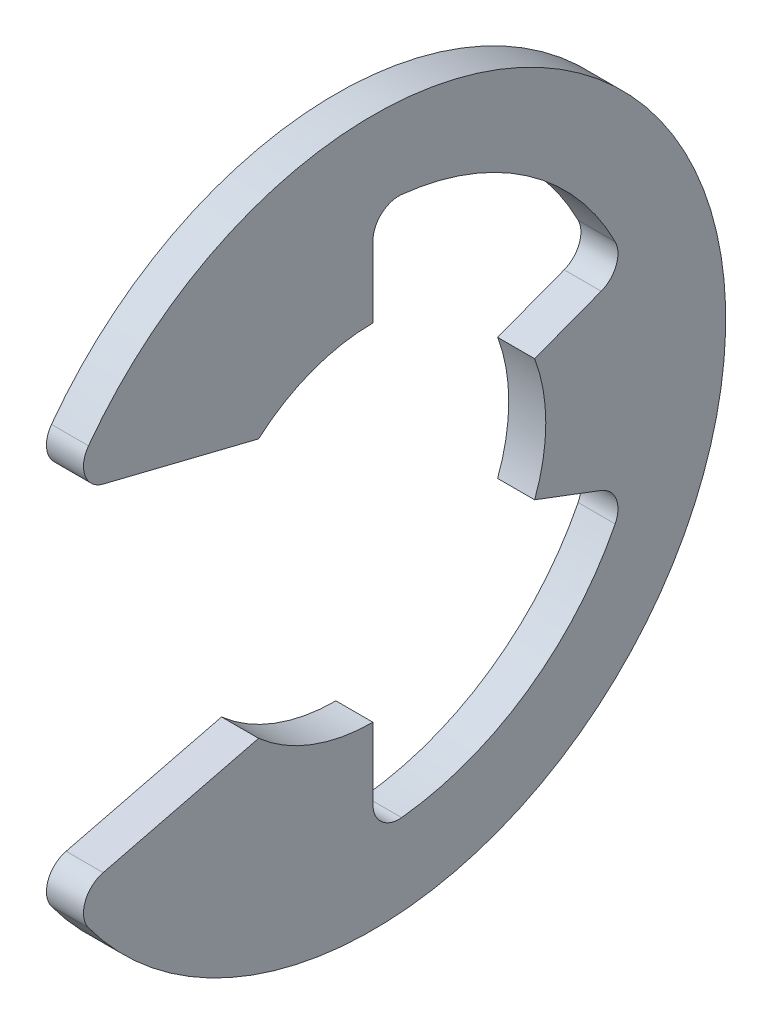
ISO-10303-21;
HEADER;
FILE_DESCRIPTION(('STEP AP214'),'2;1');
FILE_NAME('part.step','',(''),(''),'','','');
FILE_SCHEMA(('AUTOMOTIVE_DESIGN { 1 0 10303 214 1 1 1 1 }'));
ENDSEC;
DATA;
#1=APPLICATION_CONTEXT('core data for automotive mechanical design processes');
#2=APPLICATION_PROTOCOL_DEFINITION('international standard','automotive_design',2000,#1);
#3=PRODUCT_CONTEXT('',#1,'mechanical');
#4=PRODUCT('Part','Part','',(#3));
#5=PRODUCT_RELATED_PRODUCT_CATEGORY('part','',(#4));
#6=PRODUCT_DEFINITION_FORMATION('','',#4);
#7=PRODUCT_DEFINITION_CONTEXT('part definition',#1,'design');
#8=PRODUCT_DEFINITION('design','',#6,#7);
#9=PRODUCT_DEFINITION_SHAPE('','',#8);
#10=(LENGTH_UNIT() NAMED_UNIT(*) SI_UNIT(.MILLI.,.METRE.));
#11=(NAMED_UNIT(*) PLANE_ANGLE_UNIT() SI_UNIT($,.RADIAN.));
#12=(NAMED_UNIT(*) SI_UNIT($,.STERADIAN.) SOLID_ANGLE_UNIT());
#13=UNCERTAINTY_MEASURE_WITH_UNIT(LENGTH_MEASURE(1.E-05),#10,'distance_accuracy_value','');
#14=(GEOMETRIC_REPRESENTATION_CONTEXT(3) GLOBAL_UNCERTAINTY_ASSIGNED_CONTEXT((#13)) GLOBAL_UNIT_ASSIGNED_CONTEXT((#10,
#11,#12)) REPRESENTATION_CONTEXT('',''));
#15=CARTESIAN_POINT('',(0.,0.,0.));
#16=DIRECTION('',(0.,0.,1.));
#17=DIRECTION('',(1.,0.,0.));
#18=AXIS2_PLACEMENT_3D('',#15,#16,#17);
#19=CARTESIAN_POINT('',(0.5334,0.,0.));
#20=DIRECTION('',(-1.,0.,0.));
#21=DIRECTION('',(0.,0.,1.));
#22=AXIS2_PLACEMENT_3D('',#19,#20,#21);
#23=CYLINDRICAL_SURFACE('',#22,10.16);
#24=CARTESIAN_POINT('',(0.5334,0.,0.));
#25=DIRECTION('',(1.,0.,0.));
#26=DIRECTION('',(0.,0.,-1.));
#27=AXIS2_PLACEMENT_3D('',#24,#25,#26);
#28=CIRCLE('',#27,10.16);
#29=CARTESIAN_POINT('',(0.5334,-6.01157023801035,8.19064242129201));
#30=VERTEX_POINT('',#29);
#31=CARTESIAN_POINT('',(0.5334,6.01157023801035,8.19064242129201));
#32=VERTEX_POINT('',#31);
#33=EDGE_CURVE('E172',#30,#32,#28,.T.);
#34=ORIENTED_EDGE('',*,*,#33,.F.);
#35=DIRECTION('',(-1.,0.,0.));
#36=VECTOR('',#35,1.);
#37=CARTESIAN_POINT('',(0.5334,-6.01157023801035,8.190642421292));
#38=LINE('',#37,#36);
#39=CARTESIAN_POINT('',(-0.5334,-6.01157023801035,8.19064242129201));
#40=VERTEX_POINT('',#39);
#41=EDGE_CURVE('E266',#30,#40,#38,.T.);
#42=ORIENTED_EDGE('',*,*,#41,.T.);
#43=CARTESIAN_POINT('',(-0.5334,0.,0.));
#44=DIRECTION('',(1.,0.,0.));
#45=DIRECTION('',(0.,0.,-1.));
#46=AXIS2_PLACEMENT_3D('',#43,#44,#45);
#47=CIRCLE('',#46,10.16);
#48=CARTESIAN_POINT('',(-0.5334,6.01157023801035,8.19064242129201));
#49=VERTEX_POINT('',#48);
#50=EDGE_CURVE('E210',#40,#49,#47,.T.);
#51=ORIENTED_EDGE('',*,*,#50,.T.);
#52=DIRECTION('',(-1.,0.,0.));
#53=VECTOR('',#52,1.);
#54=CARTESIAN_POINT('',(0.5334,6.01157023801035,8.19064242129201));
#55=LINE('',#54,#53);
#56=EDGE_CURVE('E264',#49,#32,#55,.F.);
#57=ORIENTED_EDGE('',*,*,#56,.T.);
#58=EDGE_LOOP('',(#34,#42,#51,#57));
#59=FACE_BOUND('',#58,.T.);
#60=ADVANCED_FACE('F34',(#59),#23,.T.);
#61=CARTESIAN_POINT('',(0.5334,5.09813480407811,8.78832302088672));
#62=DIRECTION('',(0.,0.970536829925373,-0.240952820606873));
#63=DIRECTION('',(0.,0.240952820606873,0.970536829925373));
#64=AXIS2_PLACEMENT_3D('',#61,#62,#63);
#65=PLANE('',#64);
#66=DIRECTION('',(0.,-0.240952820606873,-0.970536829925373));
#67=VECTOR('',#66,1.);
#68=CARTESIAN_POINT('',(0.5334,5.09813480407811,8.78832302088672));
#69=LINE('',#68,#67);
#70=CARTESIAN_POINT('',(0.5334,4.84496174240152,7.76856413164343));
#71=VERTEX_POINT('',#70);
#72=CARTESIAN_POINT('',(0.5334,3.7338,3.29290208175099));
#73=VERTEX_POINT('',#72);
#74=EDGE_CURVE('E158',#71,#73,#69,.T.);
#75=ORIENTED_EDGE('',*,*,#74,.F.);
#76=DIRECTION('',(-1.,0.,0.));
#77=VECTOR('',#76,1.);
#78=CARTESIAN_POINT('',(0.5334,4.84496174240152,7.76856413164343));
#79=LINE('',#78,#77);
#80=CARTESIAN_POINT('',(-0.5334,4.84496174240152,7.76856413164343));
#81=VERTEX_POINT('',#80);
#82=EDGE_CURVE('E278',#71,#81,#79,.T.);
#83=ORIENTED_EDGE('',*,*,#82,.T.);
#84=DIRECTION('',(0.,-0.240952820606873,-0.970536829925373));
#85=VECTOR('',#84,1.);
#86=CARTESIAN_POINT('',(-0.5334,5.09813480407811,8.78832302088672));
#87=LINE('',#86,#85);
#88=CARTESIAN_POINT('',(-0.5334,3.7338,3.29290208175099));
#89=VERTEX_POINT('',#88);
#90=EDGE_CURVE('E178',#81,#89,#87,.T.);
#91=ORIENTED_EDGE('',*,*,#90,.T.);
#92=DIRECTION('',(-1.,0.,0.));
#93=VECTOR('',#92,1.);
#94=CARTESIAN_POINT('',(0.5334,3.7338,3.29290208175099));
#95=LINE('',#94,#93);
#96=EDGE_CURVE('E175',#73,#89,#95,.T.);
#97=ORIENTED_EDGE('',*,*,#96,.F.);
#98=EDGE_LOOP('',(#75,#83,#91,#97));
#99=FACE_BOUND('',#98,.T.);
#100=ADVANCED_FACE('F176',(#99),#65,.F.);
#101=CARTESIAN_POINT('',(0.5334,0.,0.));
#102=DIRECTION('',(-1.,0.,0.));
#103=DIRECTION('',(0.,0.,1.));
#104=AXIS2_PLACEMENT_3D('',#101,#102,#103);
#105=CYLINDRICAL_SURFACE('',#104,4.9784);
#106=CARTESIAN_POINT('',(-0.5334,0.,0.));
#107=DIRECTION('',(-1.,0.,0.));
#108=DIRECTION('',(0.,0.,1.));
#109=AXIS2_PLACEMENT_3D('',#106,#107,#108);
#110=CIRCLE('',#109,4.9784);
#111=CARTESIAN_POINT('',(-0.5334,4.9784,0.));
#112=VERTEX_POINT('',#111);
#113=EDGE_CURVE('E214',#89,#112,#110,.T.);
#114=ORIENTED_EDGE('',*,*,#113,.T.);
#115=DIRECTION('',(-1.,0.,0.));
#116=VECTOR('',#115,1.);
#117=CARTESIAN_POINT('',(0.5334,4.9784,0.));
#118=LINE('',#117,#116);
#119=CARTESIAN_POINT('',(0.5334,4.9784,0.));
#120=VERTEX_POINT('',#119);
#121=EDGE_CURVE('E182',#120,#112,#118,.T.);
#122=ORIENTED_EDGE('',*,*,#121,.F.);
#123=CARTESIAN_POINT('',(0.5334,0.,0.));
#124=DIRECTION('',(-1.,0.,0.));
#125=DIRECTION('',(0.,0.,1.));
#126=AXIS2_PLACEMENT_3D('',#123,#124,#125);
#127=CIRCLE('',#126,4.9784);
#128=EDGE_CURVE('E164',#73,#120,#127,.T.);
#129=ORIENTED_EDGE('',*,*,#128,.F.);
#130=ORIENTED_EDGE('',*,*,#96,.T.);
#131=EDGE_LOOP('',(#114,#122,#129,#130));
#132=FACE_BOUND('',#131,.T.);
#133=ADVANCED_FACE('F184',(#132),#105,.F.);
#134=CARTESIAN_POINT('',(0.5334,4.9784,0.));
#135=DIRECTION('',(0.,0.,1.));
#136=DIRECTION('',(0.,-1.,0.));
#137=AXIS2_PLACEMENT_3D('',#134,#135,#136);
#138=PLANE('',#137);
#139=DIRECTION('',(0.,1.,0.));
#140=VECTOR('',#139,1.);
#141=CARTESIAN_POINT('',(-0.5334,4.9784,0.));
#142=LINE('',#141,#140);
#143=CARTESIAN_POINT('',(-0.5334,7.02704023617216,0.));
#144=VERTEX_POINT('',#143);
#145=EDGE_CURVE('E216',#112,#144,#142,.T.);
#146=ORIENTED_EDGE('',*,*,#145,.T.);
#147=DIRECTION('',(1.,0.,0.));
#148=VECTOR('',#147,1.);
#149=CARTESIAN_POINT('',(0.5334,7.02704023617216,0.));
#150=LINE('',#149,#148);
#151=CARTESIAN_POINT('',(0.5334,7.02704023617216,0.));
#152=VERTEX_POINT('',#151);
#153=EDGE_CURVE('E262',#144,#152,#150,.T.);
#154=ORIENTED_EDGE('',*,*,#153,.T.);
#155=DIRECTION('',(0.,1.,0.));
#156=VECTOR('',#155,1.);
#157=CARTESIAN_POINT('',(0.5334,4.9784,0.));
#158=LINE('',#157,#156);
#159=EDGE_CURVE('E187',#120,#152,#158,.T.);
#160=ORIENTED_EDGE('',*,*,#159,.F.);
#161=ORIENTED_EDGE('',*,*,#121,.T.);
#162=EDGE_LOOP('',(#146,#154,#160,#161));
#163=FACE_BOUND('',#162,.T.);
#164=ADVANCED_FACE('F384',(#163),#138,.F.);
#165=CARTESIAN_POINT('',(0.5334,0.,0.));
#166=DIRECTION('',(-1.,0.,0.));
#167=DIRECTION('',(0.,0.,1.));
#168=AXIS2_PLACEMENT_3D('',#165,#166,#167);
#169=CYLINDRICAL_SURFACE('',#168,7.81336774193549);
#170=CARTESIAN_POINT('',(0.5334,0.,0.));
#171=DIRECTION('',(-1.,0.,0.));
#172=DIRECTION('',(0.,0.,-1.));
#173=AXIS2_PLACEMENT_3D('',#170,#171,#172);
#174=CIRCLE('',#173,7.81336774193549);
#175=CARTESIAN_POINT('',(0.5334,7.76961896112721,-0.825673464276603));
#176=VERTEX_POINT('',#175);
#177=CARTESIAN_POINT('',(0.5334,3.51932193149276,-6.97589339176224));
#178=VERTEX_POINT('',#177);
#179=EDGE_CURVE('E189',#176,#178,#174,.T.);
#180=ORIENTED_EDGE('',*,*,#179,.F.);
#181=DIRECTION('',(-1.,0.,0.));
#182=VECTOR('',#181,1.);
#183=CARTESIAN_POINT('',(0.5334,7.76961896112721,-0.825673464276603));
#184=LINE('',#183,#182);
#185=CARTESIAN_POINT('',(-0.5334,7.76961896112721,-0.825673464276603));
#186=VERTEX_POINT('',#185);
#187=EDGE_CURVE('E259',#176,#186,#184,.T.);
#188=ORIENTED_EDGE('',*,*,#187,.T.);
#189=CARTESIAN_POINT('',(-0.5334,0.,0.));
#190=DIRECTION('',(-1.,0.,0.));
#191=DIRECTION('',(0.,0.,-1.));
#192=AXIS2_PLACEMENT_3D('',#189,#190,#191);
#193=CIRCLE('',#192,7.81336774193549);
#194=CARTESIAN_POINT('',(-0.5334,3.51932193149276,-6.97589339176224));
#195=VERTEX_POINT('',#194);
#196=EDGE_CURVE('E219',#186,#195,#193,.T.);
#197=ORIENTED_EDGE('',*,*,#196,.T.);
#198=DIRECTION('',(-1.,0.,0.));
#199=VECTOR('',#198,1.);
#200=CARTESIAN_POINT('',(0.5334,3.51932193149276,-6.97589339176224));
#201=LINE('',#200,#199);
#202=EDGE_CURVE('E257',#195,#178,#201,.F.);
#203=ORIENTED_EDGE('',*,*,#202,.T.);
#204=EDGE_LOOP('',(#180,#188,#197,#203));
#205=FACE_BOUND('',#204,.T.);
#206=ADVANCED_FACE('F306',(#205),#169,.F.);
#207=CARTESIAN_POINT('',(0.5334,1.76013019972955,-4.65686678357885));
#208=DIRECTION('',(0.,-0.935414346693485,-0.353553390593274));
#209=DIRECTION('',(0.,0.353553390593274,-0.935414346693485));
#210=AXIS2_PLACEMENT_3D('',#207,#208,#209);
#211=PLANE('',#210);
#212=DIRECTION('',(0.,-0.353553390593274,0.935414346693485));
#213=VECTOR('',#212,1.);
#214=CARTESIAN_POINT('',(0.5334,1.76013019972955,-4.65686678357885));
#215=LINE('',#214,#213);
#216=CARTESIAN_POINT('',(0.5334,2.48443390133403,-6.57319425170782));
#217=VERTEX_POINT('',#216);
#218=CARTESIAN_POINT('',(0.5334,1.76013019972956,-4.65686678357885));
#219=VERTEX_POINT('',#218);
#220=EDGE_CURVE('E194',#217,#219,#215,.T.);
#221=ORIENTED_EDGE('',*,*,#220,.F.);
#222=DIRECTION('',(1.,0.,0.));
#223=VECTOR('',#222,1.);
#224=CARTESIAN_POINT('',(-0.5334,2.48443390133403,-6.57319425170782));
#225=LINE('',#224,#223);
#226=CARTESIAN_POINT('',(-0.5334,2.48443390133403,-6.57319425170782));
#227=VERTEX_POINT('',#226);
#228=EDGE_CURVE('E281',#217,#227,#225,.F.);
#229=ORIENTED_EDGE('',*,*,#228,.T.);
#230=DIRECTION('',(0.,-0.353553390593274,0.935414346693485));
#231=VECTOR('',#230,1.);
#232=CARTESIAN_POINT('',(-0.5334,1.76013019972955,-4.65686678357885));
#233=LINE('',#232,#231);
#234=CARTESIAN_POINT('',(-0.5334,1.76013019972956,-4.65686678357885));
#235=VERTEX_POINT('',#234);
#236=EDGE_CURVE('E222',#227,#235,#233,.T.);
#237=ORIENTED_EDGE('',*,*,#236,.T.);
#238=DIRECTION('',(-1.,0.,0.));
#239=VECTOR('',#238,1.);
#240=CARTESIAN_POINT('',(0.5334,1.76013019972956,-4.65686678357885));
#241=LINE('',#240,#239);
#242=EDGE_CURVE('E246',#219,#235,#241,.T.);
#243=ORIENTED_EDGE('',*,*,#242,.F.);
#244=EDGE_LOOP('',(#221,#229,#237,#243));
#245=FACE_BOUND('',#244,.T.);
#246=ADVANCED_FACE('F309',(#245),#211,.F.);
#247=CARTESIAN_POINT('',(0.5334,0.,0.));
#248=DIRECTION('',(-1.,0.,0.));
#249=DIRECTION('',(0.,0.,1.));
#250=AXIS2_PLACEMENT_3D('',#247,#248,#249);
#251=CYLINDRICAL_SURFACE('',#250,4.9784);
#252=CARTESIAN_POINT('',(-0.5334,0.,0.));
#253=DIRECTION('',(-1.,0.,0.));
#254=DIRECTION('',(0.,0.,1.));
#255=AXIS2_PLACEMENT_3D('',#252,#253,#254);
#256=CIRCLE('',#255,4.9784);
#257=CARTESIAN_POINT('',(-0.5334,-1.76013019972955,-4.65686678357885));
#258=VERTEX_POINT('',#257);
#259=EDGE_CURVE('E224',#235,#258,#256,.T.);
#260=ORIENTED_EDGE('',*,*,#259,.T.);
#261=DIRECTION('',(-1.,0.,0.));
#262=VECTOR('',#261,1.);
#263=CARTESIAN_POINT('',(0.5334,-1.76013019972955,-4.65686678357885));
#264=LINE('',#263,#262);
#265=CARTESIAN_POINT('',(0.5334,-1.76013019972955,-4.65686678357885));
#266=VERTEX_POINT('',#265);
#267=EDGE_CURVE('E243',#266,#258,#264,.T.);
#268=ORIENTED_EDGE('',*,*,#267,.F.);
#269=CARTESIAN_POINT('',(0.5334,0.,0.));
#270=DIRECTION('',(-1.,0.,0.));
#271=DIRECTION('',(0.,0.,1.));
#272=AXIS2_PLACEMENT_3D('',#269,#270,#271);
#273=CIRCLE('',#272,4.9784);
#274=EDGE_CURVE('E196',#219,#266,#273,.T.);
#275=ORIENTED_EDGE('',*,*,#274,.F.);
#276=ORIENTED_EDGE('',*,*,#242,.T.);
#277=EDGE_LOOP('',(#260,#268,#275,#276));
#278=FACE_BOUND('',#277,.T.);
#279=ADVANCED_FACE('F315',(#278),#251,.F.);
#280=CARTESIAN_POINT('',(0.5334,-1.76013019972955,-4.65686678357885));
#281=DIRECTION('',(0.,0.935414346693485,-0.353553390593274));
#282=DIRECTION('',(0.,0.353553390593274,0.935414346693485));
#283=AXIS2_PLACEMENT_3D('',#280,#281,#282);
#284=PLANE('',#283);
#285=DIRECTION('',(0.,-0.353553390593274,-0.935414346693485));
#286=VECTOR('',#285,1.);
#287=CARTESIAN_POINT('',(-0.5334,-1.76013019972955,-4.65686678357885));
#288=LINE('',#287,#286);
#289=CARTESIAN_POINT('',(-0.5334,-2.48443390133403,-6.57319425170782));
#290=VERTEX_POINT('',#289);
#291=EDGE_CURVE('E226',#258,#290,#288,.T.);
#292=ORIENTED_EDGE('',*,*,#291,.T.);
#293=DIRECTION('',(1.,0.,0.));
#294=VECTOR('',#293,1.);
#295=CARTESIAN_POINT('',(0.5334,-2.48443390133403,-6.57319425170782));
#296=LINE('',#295,#294);
#297=CARTESIAN_POINT('',(0.5334,-2.48443390133403,-6.57319425170782));
#298=VERTEX_POINT('',#297);
#299=EDGE_CURVE('E49',#290,#298,#296,.T.);
#300=ORIENTED_EDGE('',*,*,#299,.T.);
#301=DIRECTION('',(0.,-0.353553390593274,-0.935414346693485));
#302=VECTOR('',#301,1.);
#303=CARTESIAN_POINT('',(0.5334,-1.76013019972955,-4.65686678357885));
#304=LINE('',#303,#302);
#305=EDGE_CURVE('E198',#266,#298,#304,.T.);
#306=ORIENTED_EDGE('',*,*,#305,.F.);
#307=ORIENTED_EDGE('',*,*,#267,.T.);
#308=EDGE_LOOP('',(#292,#300,#306,#307));
#309=FACE_BOUND('',#308,.T.);
#310=ADVANCED_FACE('F317',(#309),#284,.F.);
#311=CARTESIAN_POINT('',(0.5334,0.,0.));
#312=DIRECTION('',(-1.,0.,0.));
#313=DIRECTION('',(0.,0.,1.));
#314=AXIS2_PLACEMENT_3D('',#311,#312,#313);
#315=CYLINDRICAL_SURFACE('',#314,7.81336774193548);
#316=CARTESIAN_POINT('',(-0.5334,0.,0.));
#317=DIRECTION('',(-1.,0.,0.));
#318=DIRECTION('',(0.,0.,-1.));
#319=AXIS2_PLACEMENT_3D('',#316,#317,#318);
#320=CIRCLE('',#319,7.81336774193548);
#321=CARTESIAN_POINT('',(-0.5334,-3.51932193149276,-6.97589339176224));
#322=VERTEX_POINT('',#321);
#323=CARTESIAN_POINT('',(-0.5334,-7.76961896112721,-0.825673464276605));
#324=VERTEX_POINT('',#323);
#325=EDGE_CURVE('E228',#322,#324,#320,.T.);
#326=ORIENTED_EDGE('',*,*,#325,.T.);
#327=DIRECTION('',(-1.,0.,0.));
#328=VECTOR('',#327,1.);
#329=CARTESIAN_POINT('',(0.5334,-7.76961896112721,-0.825673464276605));
#330=LINE('',#329,#328);
#331=CARTESIAN_POINT('',(0.5334,-7.76961896112721,-0.825673464276605));
#332=VERTEX_POINT('',#331);
#333=EDGE_CURVE('E255',#324,#332,#330,.F.);
#334=ORIENTED_EDGE('',*,*,#333,.T.);
#335=CARTESIAN_POINT('',(0.5334,0.,0.));
#336=DIRECTION('',(-1.,0.,0.));
#337=DIRECTION('',(0.,0.,-1.));
#338=AXIS2_PLACEMENT_3D('',#335,#336,#337);
#339=CIRCLE('',#338,7.81336774193548);
#340=CARTESIAN_POINT('',(0.5334,-3.51932193149276,-6.97589339176224));
#341=VERTEX_POINT('',#340);
#342=EDGE_CURVE('E200',#341,#332,#339,.T.);
#343=ORIENTED_EDGE('',*,*,#342,.F.);
#344=DIRECTION('',(-1.,0.,0.));
#345=VECTOR('',#344,1.);
#346=CARTESIAN_POINT('',(0.5334,-3.51932193149276,-6.97589339176224));
#347=LINE('',#346,#345);
#348=EDGE_CURVE('E252',#341,#322,#347,.T.);
#349=ORIENTED_EDGE('',*,*,#348,.T.);
#350=EDGE_LOOP('',(#326,#334,#343,#349));
#351=FACE_BOUND('',#350,.T.);
#352=ADVANCED_FACE('F319',(#351),#315,.F.);
#353=CARTESIAN_POINT('',(0.5334,-4.9784,0.));
#354=DIRECTION('',(0.,0.,1.));
#355=DIRECTION('',(0.,-1.,0.));
#356=AXIS2_PLACEMENT_3D('',#353,#354,#355);
#357=PLANE('',#356);
#358=DIRECTION('',(0.,1.,0.));
#359=VECTOR('',#358,1.);
#360=CARTESIAN_POINT('',(0.5334,-4.9784,0.));
#361=LINE('',#360,#359);
#362=CARTESIAN_POINT('',(0.5334,-7.02704023617216,0.));
#363=VERTEX_POINT('',#362);
#364=CARTESIAN_POINT('',(0.5334,-4.9784,0.));
#365=VERTEX_POINT('',#364);
#366=EDGE_CURVE('E203',#363,#365,#361,.T.);
#367=ORIENTED_EDGE('',*,*,#366,.F.);
#368=DIRECTION('',(1.,0.,0.));
#369=VECTOR('',#368,1.);
#370=CARTESIAN_POINT('',(-0.5334,-7.02704023617216,0.));
#371=LINE('',#370,#369);
#372=CARTESIAN_POINT('',(-0.5334,-7.02704023617216,0.));
#373=VERTEX_POINT('',#372);
#374=EDGE_CURVE('E181',#363,#373,#371,.F.);
#375=ORIENTED_EDGE('',*,*,#374,.T.);
#376=DIRECTION('',(0.,1.,0.));
#377=VECTOR('',#376,1.);
#378=CARTESIAN_POINT('',(-0.5334,-4.9784,0.));
#379=LINE('',#378,#377);
#380=CARTESIAN_POINT('',(-0.5334,-4.9784,0.));
#381=VERTEX_POINT('',#380);
#382=EDGE_CURVE('E231',#373,#381,#379,.T.);
#383=ORIENTED_EDGE('',*,*,#382,.T.);
#384=DIRECTION('',(-1.,0.,0.));
#385=VECTOR('',#384,1.);
#386=CARTESIAN_POINT('',(0.5334,-4.9784,0.));
#387=LINE('',#386,#385);
#388=EDGE_CURVE('E240',#365,#381,#387,.T.);
#389=ORIENTED_EDGE('',*,*,#388,.F.);
#390=EDGE_LOOP('',(#367,#375,#383,#389));
#391=FACE_BOUND('',#390,.T.);
#392=ADVANCED_FACE('F325',(#391),#357,.F.);
#393=CARTESIAN_POINT('',(0.5334,0.,0.));
#394=DIRECTION('',(-1.,0.,0.));
#395=DIRECTION('',(0.,0.,1.));
#396=AXIS2_PLACEMENT_3D('',#393,#394,#395);
#397=CYLINDRICAL_SURFACE('',#396,4.9784);
#398=CARTESIAN_POINT('',(-0.5334,0.,0.));
#399=DIRECTION('',(-1.,0.,0.));
#400=DIRECTION('',(0.,0.,-1.));
#401=AXIS2_PLACEMENT_3D('',#398,#399,#400);
#402=CIRCLE('',#401,4.9784);
#403=CARTESIAN_POINT('',(-0.5334,-3.7338,3.29290208175099));
#404=VERTEX_POINT('',#403);
#405=EDGE_CURVE('E233',#381,#404,#402,.T.);
#406=ORIENTED_EDGE('',*,*,#405,.T.);
#407=DIRECTION('',(-1.,0.,0.));
#408=VECTOR('',#407,1.);
#409=CARTESIAN_POINT('',(0.5334,-3.7338,3.29290208175099));
#410=LINE('',#409,#408);
#411=CARTESIAN_POINT('',(0.5334,-3.7338,3.29290208175099));
#412=VERTEX_POINT('',#411);
#413=EDGE_CURVE('E209',#412,#404,#410,.T.);
#414=ORIENTED_EDGE('',*,*,#413,.F.);
#415=CARTESIAN_POINT('',(0.5334,0.,0.));
#416=DIRECTION('',(-1.,0.,0.));
#417=DIRECTION('',(0.,0.,-1.));
#418=AXIS2_PLACEMENT_3D('',#415,#416,#417);
#419=CIRCLE('',#418,4.9784);
#420=EDGE_CURVE('E205',#365,#412,#419,.T.);
#421=ORIENTED_EDGE('',*,*,#420,.F.);
#422=ORIENTED_EDGE('',*,*,#388,.T.);
#423=EDGE_LOOP('',(#406,#414,#421,#422));
#424=FACE_BOUND('',#423,.T.);
#425=ADVANCED_FACE('F374',(#424),#397,.F.);
#426=CARTESIAN_POINT('',(0.5334,-5.09813480407811,8.78832302088672));
#427=DIRECTION('',(0.,-0.970536829925373,-0.240952820606873));
#428=DIRECTION('',(0.,0.240952820606873,-0.970536829925373));
#429=AXIS2_PLACEMENT_3D('',#426,#427,#428);
#430=PLANE('',#429);
#431=DIRECTION('',(0.,-0.240952820606873,0.970536829925373));
#432=VECTOR('',#431,1.);
#433=CARTESIAN_POINT('',(-0.5334,-5.09813480407811,8.78832302088672));
#434=LINE('',#433,#432);
#435=CARTESIAN_POINT('',(-0.5334,-4.84496174240152,7.76856413164343));
#436=VERTEX_POINT('',#435);
#437=EDGE_CURVE('E235',#404,#436,#434,.T.);
#438=ORIENTED_EDGE('',*,*,#437,.T.);
#439=DIRECTION('',(-1.,0.,0.));
#440=VECTOR('',#439,1.);
#441=CARTESIAN_POINT('',(0.5334,-4.84496174240152,7.76856413164343));
#442=LINE('',#441,#440);
#443=CARTESIAN_POINT('',(0.5334,-4.84496174240152,7.76856413164343));
#444=VERTEX_POINT('',#443);
#445=EDGE_CURVE('E273',#436,#444,#442,.F.);
#446=ORIENTED_EDGE('',*,*,#445,.T.);
#447=DIRECTION('',(0.,-0.240952820606873,0.970536829925373));
#448=VECTOR('',#447,1.);
#449=CARTESIAN_POINT('',(0.5334,-5.09813480407811,8.78832302088672));
#450=LINE('',#449,#448);
#451=EDGE_CURVE('E207',#412,#444,#450,.T.);
#452=ORIENTED_EDGE('',*,*,#451,.F.);
#453=ORIENTED_EDGE('',*,*,#413,.T.);
#454=EDGE_LOOP('',(#438,#446,#452,#453));
#455=FACE_BOUND('',#454,.T.);
#456=ADVANCED_FACE('F416',(#455),#430,.F.);
#457=CARTESIAN_POINT('',(0.5334,0.,0.));
#458=DIRECTION('',(1.,0.,0.));
#459=DIRECTION('',(0.,0.,-1.));
#460=AXIS2_PLACEMENT_3D('',#457,#458,#459);
#461=PLANE('',#460);
#462=ORIENTED_EDGE('',*,*,#451,.T.);
#463=CARTESIAN_POINT('',(0.5334,-5.56971982551659,7.58863020332704));
#464=DIRECTION('',(1.,0.,0.));
#465=DIRECTION('',(0.,0.,-1.));
#466=AXIS2_PLACEMENT_3D('',#463,#464,#465);
#467=CIRCLE('',#466,0.74676);
#468=EDGE_CURVE('E276',#444,#30,#467,.T.);
#469=ORIENTED_EDGE('',*,*,#468,.T.);
#470=ORIENTED_EDGE('',*,*,#33,.T.);
#471=CARTESIAN_POINT('',(0.5334,5.56971982551659,7.58863020332704));
#472=DIRECTION('',(1.,0.,0.));
#473=DIRECTION('',(0.,0.,-1.));
#474=AXIS2_PLACEMENT_3D('',#471,#472,#473);
#475=CIRCLE('',#474,0.74676);
#476=EDGE_CURVE('E168',#32,#71,#475,.T.);
#477=ORIENTED_EDGE('',*,*,#476,.T.);
#478=ORIENTED_EDGE('',*,*,#74,.T.);
#479=ORIENTED_EDGE('',*,*,#128,.T.);
#480=ORIENTED_EDGE('',*,*,#159,.T.);
#481=CARTESIAN_POINT('',(0.5334,7.02704023617216,-0.746759999999999));
#482=DIRECTION('',(1.,0.,0.));
#483=DIRECTION('',(0.,0.,-1.));
#484=AXIS2_PLACEMENT_3D('',#481,#482,#483);
#485=CIRCLE('',#484,0.74676);
#486=EDGE_CURVE('E290',#152,#176,#485,.F.);
#487=ORIENTED_EDGE('',*,*,#486,.T.);
#488=ORIENTED_EDGE('',*,*,#179,.T.);
#489=CARTESIAN_POINT('',(0.5334,3.18296391887086,-6.30917472174839));
#490=DIRECTION('',(1.,0.,0.));
#491=DIRECTION('',(0.,0.,-1.));
#492=AXIS2_PLACEMENT_3D('',#489,#490,#491);
#493=CIRCLE('',#492,0.74676);
#494=EDGE_CURVE('E11',#178,#217,#493,.F.);
#495=ORIENTED_EDGE('',*,*,#494,.T.);
#496=ORIENTED_EDGE('',*,*,#220,.T.);
#497=ORIENTED_EDGE('',*,*,#274,.T.);
#498=ORIENTED_EDGE('',*,*,#305,.T.);
#499=CARTESIAN_POINT('',(0.5334,-3.18296391887085,-6.30917472174839));
#500=DIRECTION('',(1.,0.,0.));
#501=DIRECTION('',(0.,0.,-1.));
#502=AXIS2_PLACEMENT_3D('',#499,#500,#501);
#503=CIRCLE('',#502,0.74676);
#504=EDGE_CURVE('E294',#298,#341,#503,.F.);
#505=ORIENTED_EDGE('',*,*,#504,.T.);
#506=ORIENTED_EDGE('',*,*,#342,.T.);
#507=CARTESIAN_POINT('',(0.5334,-7.02704023617216,-0.746760000000001));
#508=DIRECTION('',(1.,0.,0.));
#509=DIRECTION('',(0.,0.,-1.));
#510=AXIS2_PLACEMENT_3D('',#507,#508,#509);
#511=CIRCLE('',#510,0.74676);
#512=EDGE_CURVE('E286',#332,#363,#511,.F.);
#513=ORIENTED_EDGE('',*,*,#512,.T.);
#514=ORIENTED_EDGE('',*,*,#366,.T.);
#515=ORIENTED_EDGE('',*,*,#420,.T.);
#516=EDGE_LOOP('',(#462,#469,#470,#477,#478,#479,#480,#487,#488,#495,#496,#497,#498,#505,#506,
#513,#514,#515));
#517=FACE_BOUND('',#516,.T.);
#518=ADVANCED_FACE('F161',(#517),#461,.T.);
#519=CARTESIAN_POINT('',(-0.5334,0.,0.));
#520=DIRECTION('',(1.,0.,0.));
#521=DIRECTION('',(0.,0.,-1.));
#522=AXIS2_PLACEMENT_3D('',#519,#520,#521);
#523=PLANE('',#522);
#524=ORIENTED_EDGE('',*,*,#50,.F.);
#525=CARTESIAN_POINT('',(-0.5334,-5.56971982551659,7.58863020332704));
#526=DIRECTION('',(1.,0.,0.));
#527=DIRECTION('',(0.,0.,-1.));
#528=AXIS2_PLACEMENT_3D('',#525,#526,#527);
#529=CIRCLE('',#528,0.74676);
#530=EDGE_CURVE('E271',#40,#436,#529,.F.);
#531=ORIENTED_EDGE('',*,*,#530,.T.);
#532=ORIENTED_EDGE('',*,*,#437,.F.);
#533=ORIENTED_EDGE('',*,*,#405,.F.);
#534=ORIENTED_EDGE('',*,*,#382,.F.);
#535=CARTESIAN_POINT('',(-0.5334,-7.02704023617216,-0.746760000000001));
#536=DIRECTION('',(1.,0.,0.));
#537=DIRECTION('',(0.,0.,-1.));
#538=AXIS2_PLACEMENT_3D('',#535,#536,#537);
#539=CIRCLE('',#538,0.74676);
#540=EDGE_CURVE('E284',#373,#324,#539,.T.);
#541=ORIENTED_EDGE('',*,*,#540,.T.);
#542=ORIENTED_EDGE('',*,*,#325,.F.);
#543=CARTESIAN_POINT('',(-0.5334,-3.18296391887085,-6.30917472174839));
#544=DIRECTION('',(1.,0.,0.));
#545=DIRECTION('',(0.,0.,-1.));
#546=AXIS2_PLACEMENT_3D('',#543,#544,#545);
#547=CIRCLE('',#546,0.74676);
#548=EDGE_CURVE('E292',#322,#290,#547,.T.);
#549=ORIENTED_EDGE('',*,*,#548,.T.);
#550=ORIENTED_EDGE('',*,*,#291,.F.);
#551=ORIENTED_EDGE('',*,*,#259,.F.);
#552=ORIENTED_EDGE('',*,*,#236,.F.);
#553=CARTESIAN_POINT('',(-0.5334,3.18296391887086,-6.30917472174839));
#554=DIRECTION('',(1.,0.,0.));
#555=DIRECTION('',(0.,0.,-1.));
#556=AXIS2_PLACEMENT_3D('',#553,#554,#555);
#557=CIRCLE('',#556,0.74676);
#558=EDGE_CURVE('E42',#227,#195,#557,.T.);
#559=ORIENTED_EDGE('',*,*,#558,.T.);
#560=ORIENTED_EDGE('',*,*,#196,.F.);
#561=CARTESIAN_POINT('',(-0.5334,7.02704023617216,-0.746759999999999));
#562=DIRECTION('',(1.,0.,0.));
#563=DIRECTION('',(0.,0.,-1.));
#564=AXIS2_PLACEMENT_3D('',#561,#562,#563);
#565=CIRCLE('',#564,0.74676);
#566=EDGE_CURVE('E288',#186,#144,#565,.T.);
#567=ORIENTED_EDGE('',*,*,#566,.T.);
#568=ORIENTED_EDGE('',*,*,#145,.F.);
#569=ORIENTED_EDGE('',*,*,#113,.F.);
#570=ORIENTED_EDGE('',*,*,#90,.F.);
#571=CARTESIAN_POINT('',(-0.5334,5.56971982551659,7.58863020332704));
#572=DIRECTION('',(1.,0.,0.));
#573=DIRECTION('',(0.,0.,-1.));
#574=AXIS2_PLACEMENT_3D('',#571,#572,#573);
#575=CIRCLE('',#574,0.74676);
#576=EDGE_CURVE('E269',#81,#49,#575,.F.);
#577=ORIENTED_EDGE('',*,*,#576,.T.);
#578=EDGE_LOOP('',(#524,#531,#532,#533,#534,#541,#542,#549,#550,#551,#552,#559,#560,#567,#568,
#569,#570,#577));
#579=FACE_BOUND('',#578,.T.);
#580=ADVANCED_FACE('F299',(#579),#523,.F.);
#581=CARTESIAN_POINT('',(0.5334,-7.02704023617216,-0.746760000000001));
#582=DIRECTION('',(-1.,0.,0.));
#583=DIRECTION('',(0.,0.,1.));
#584=AXIS2_PLACEMENT_3D('',#581,#582,#583);
#585=CYLINDRICAL_SURFACE('',#584,0.74676);
#586=ORIENTED_EDGE('',*,*,#512,.F.);
#587=ORIENTED_EDGE('',*,*,#333,.F.);
#588=ORIENTED_EDGE('',*,*,#540,.F.);
#589=ORIENTED_EDGE('',*,*,#374,.F.);
#590=EDGE_LOOP('',(#586,#587,#588,#589));
#591=FACE_BOUND('',#590,.T.);
#592=ADVANCED_FACE('F339',(#591),#585,.F.);
#593=CARTESIAN_POINT('',(0.5334,7.02704023617216,-0.746759999999999));
#594=DIRECTION('',(-1.,0.,0.));
#595=DIRECTION('',(0.,0.,1.));
#596=AXIS2_PLACEMENT_3D('',#593,#594,#595);
#597=CYLINDRICAL_SURFACE('',#596,0.74676);
#598=ORIENTED_EDGE('',*,*,#486,.F.);
#599=ORIENTED_EDGE('',*,*,#153,.F.);
#600=ORIENTED_EDGE('',*,*,#566,.F.);
#601=ORIENTED_EDGE('',*,*,#187,.F.);
#602=EDGE_LOOP('',(#598,#599,#600,#601));
#603=FACE_BOUND('',#602,.T.);
#604=ADVANCED_FACE('F342',(#603),#597,.F.);
#605=CARTESIAN_POINT('',(0.5334,-5.56971982551659,7.58863020332704));
#606=DIRECTION('',(-1.,0.,0.));
#607=DIRECTION('',(0.,0.,1.));
#608=AXIS2_PLACEMENT_3D('',#605,#606,#607);
#609=CYLINDRICAL_SURFACE('',#608,0.74676);
#610=ORIENTED_EDGE('',*,*,#468,.F.);
#611=ORIENTED_EDGE('',*,*,#445,.F.);
#612=ORIENTED_EDGE('',*,*,#530,.F.);
#613=ORIENTED_EDGE('',*,*,#41,.F.);
#614=EDGE_LOOP('',(#610,#611,#612,#613));
#615=FACE_BOUND('',#614,.T.);
#616=ADVANCED_FACE('F346',(#615),#609,.T.);
#617=CARTESIAN_POINT('',(0.5334,5.56971982551659,7.58863020332704));
#618=DIRECTION('',(-1.,0.,0.));
#619=DIRECTION('',(0.,0.,1.));
#620=AXIS2_PLACEMENT_3D('',#617,#618,#619);
#621=CYLINDRICAL_SURFACE('',#620,0.74676);
#622=ORIENTED_EDGE('',*,*,#476,.F.);
#623=ORIENTED_EDGE('',*,*,#56,.F.);
#624=ORIENTED_EDGE('',*,*,#576,.F.);
#625=ORIENTED_EDGE('',*,*,#82,.F.);
#626=EDGE_LOOP('',(#622,#623,#624,#625));
#627=FACE_BOUND('',#626,.T.);
#628=ADVANCED_FACE('F350',(#627),#621,.T.);
#629=CARTESIAN_POINT('',(0.5334,-3.18296391887085,-6.30917472174839));
#630=DIRECTION('',(-1.,0.,0.));
#631=DIRECTION('',(0.,0.,1.));
#632=AXIS2_PLACEMENT_3D('',#629,#630,#631);
#633=CYLINDRICAL_SURFACE('',#632,0.74676);
#634=ORIENTED_EDGE('',*,*,#504,.F.);
#635=ORIENTED_EDGE('',*,*,#299,.F.);
#636=ORIENTED_EDGE('',*,*,#548,.F.);
#637=ORIENTED_EDGE('',*,*,#348,.F.);
#638=EDGE_LOOP('',(#634,#635,#636,#637));
#639=FACE_BOUND('',#638,.T.);
#640=ADVANCED_FACE('F353',(#639),#633,.F.);
#641=CARTESIAN_POINT('',(0.5334,3.18296391887086,-6.30917472174839));
#642=DIRECTION('',(-1.,0.,0.));
#643=DIRECTION('',(0.,0.,1.));
#644=AXIS2_PLACEMENT_3D('',#641,#642,#643);
#645=CYLINDRICAL_SURFACE('',#644,0.74676);
#646=ORIENTED_EDGE('',*,*,#494,.F.);
#647=ORIENTED_EDGE('',*,*,#202,.F.);
#648=ORIENTED_EDGE('',*,*,#558,.F.);
#649=ORIENTED_EDGE('',*,*,#228,.F.);
#650=EDGE_LOOP('',(#646,#647,#648,#649));
#651=FACE_BOUND('',#650,.T.);
#652=ADVANCED_FACE('F36',(#651),#645,.F.);
#653=CLOSED_SHELL('',(#60,#100,#133,#164,#206,#246,#279,#310,#352,#392,#425,#456,#518,#580,#592,
#604,#616,#628,#640,#652));
#654=MANIFOLD_SOLID_BREP('B2',#653);
#655=ADVANCED_BREP_SHAPE_REPRESENTATION('',(#18,#654),#14);
#656=SHAPE_DEFINITION_REPRESENTATION(#9,#655);
ENDSEC;
END-ISO-10303-21;
